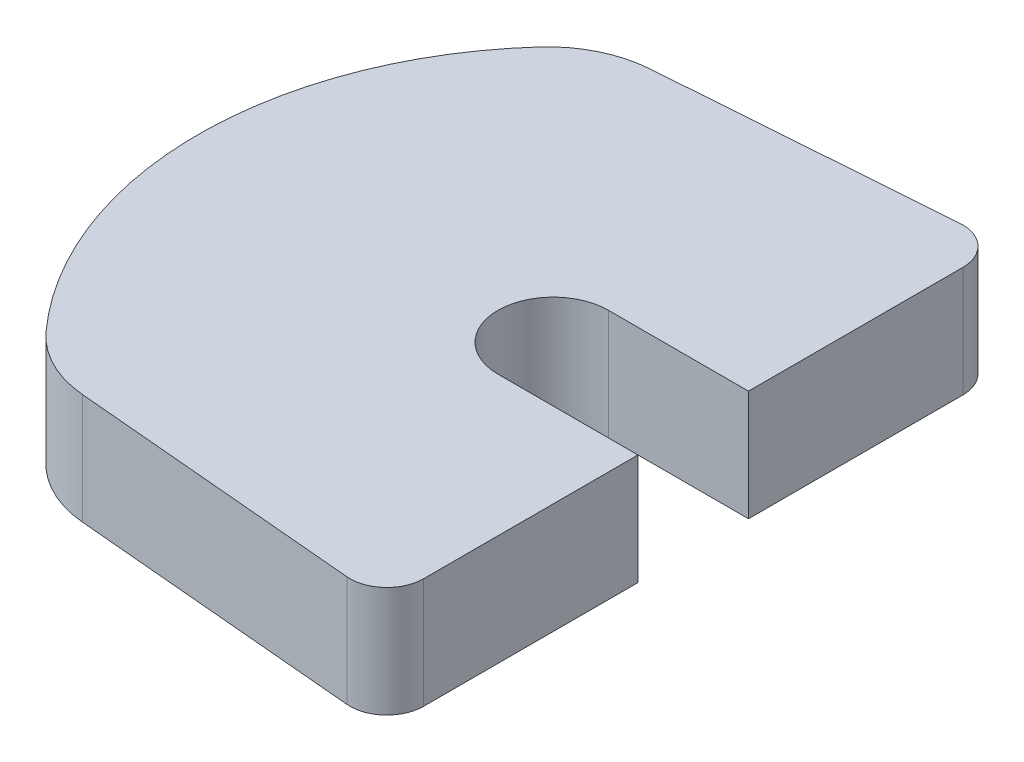
ISO-10303-21;
HEADER;
FILE_DESCRIPTION(('STEP AP214'),'2;1');
FILE_NAME('part.step','',(''),(''),'','','');
FILE_SCHEMA(('AUTOMOTIVE_DESIGN { 1 0 10303 214 1 1 1 1 }'));
ENDSEC;
DATA;
#1=APPLICATION_CONTEXT('core data for automotive mechanical design processes');
#2=APPLICATION_PROTOCOL_DEFINITION('international standard','automotive_design',2000,#1);
#3=PRODUCT_CONTEXT('',#1,'mechanical');
#4=PRODUCT('Part','Part','',(#3));
#5=PRODUCT_RELATED_PRODUCT_CATEGORY('part','',(#4));
#6=PRODUCT_DEFINITION_FORMATION('','',#4);
#7=PRODUCT_DEFINITION_CONTEXT('part definition',#1,'design');
#8=PRODUCT_DEFINITION('design','',#6,#7);
#9=PRODUCT_DEFINITION_SHAPE('','',#8);
#10=(LENGTH_UNIT() NAMED_UNIT(*) SI_UNIT(.MILLI.,.METRE.));
#11=(NAMED_UNIT(*) PLANE_ANGLE_UNIT() SI_UNIT($,.RADIAN.));
#12=(NAMED_UNIT(*) SI_UNIT($,.STERADIAN.) SOLID_ANGLE_UNIT());
#13=UNCERTAINTY_MEASURE_WITH_UNIT(LENGTH_MEASURE(1.E-05),#10,'distance_accuracy_value','');
#14=(GEOMETRIC_REPRESENTATION_CONTEXT(3) GLOBAL_UNCERTAINTY_ASSIGNED_CONTEXT((#13)) GLOBAL_UNIT_ASSIGNED_CONTEXT((#10,
#11,#12)) REPRESENTATION_CONTEXT('',''));
#15=CARTESIAN_POINT('',(0.,0.,0.));
#16=DIRECTION('',(0.,0.,1.));
#17=DIRECTION('',(1.,0.,0.));
#18=AXIS2_PLACEMENT_3D('',#15,#16,#17);
#19=CARTESIAN_POINT('',(0.,3.,-1.5));
#20=DIRECTION('',(0.,-1.,0.));
#21=DIRECTION('',(0.,0.,-1.));
#22=AXIS2_PLACEMENT_3D('',#19,#20,#21);
#23=CYLINDRICAL_SURFACE('',#22,1.5);
#24=CARTESIAN_POINT('',(0.,0.,-1.5));
#25=DIRECTION('',(0.,-1.,0.));
#26=DIRECTION('',(0.,0.,1.));
#27=AXIS2_PLACEMENT_3D('',#24,#25,#26);
#28=CIRCLE('',#27,1.5);
#29=CARTESIAN_POINT('',(0.,0.,0.));
#30=VERTEX_POINT('',#29);
#31=CARTESIAN_POINT('',(0.,0.,-3.));
#32=VERTEX_POINT('',#31);
#33=EDGE_CURVE('E153',#30,#32,#28,.T.);
#34=ORIENTED_EDGE('',*,*,#33,.T.);
#35=DIRECTION('',(0.,-1.,0.));
#36=VECTOR('',#35,1.);
#37=CARTESIAN_POINT('',(0.,3.,-3.));
#38=LINE('',#37,#36);
#39=CARTESIAN_POINT('',(0.,3.,-3.));
#40=VERTEX_POINT('',#39);
#41=EDGE_CURVE('E11',#40,#32,#38,.T.);
#42=ORIENTED_EDGE('',*,*,#41,.F.);
#43=CARTESIAN_POINT('',(0.,3.,-1.5));
#44=DIRECTION('',(0.,-1.,0.));
#45=DIRECTION('',(0.,0.,1.));
#46=AXIS2_PLACEMENT_3D('',#43,#44,#45);
#47=CIRCLE('',#46,1.5);
#48=CARTESIAN_POINT('',(0.,3.,0.));
#49=VERTEX_POINT('',#48);
#50=EDGE_CURVE('E175',#49,#40,#47,.T.);
#51=ORIENTED_EDGE('',*,*,#50,.F.);
#52=DIRECTION('',(0.,-1.,0.));
#53=VECTOR('',#52,1.);
#54=CARTESIAN_POINT('',(0.,3.,0.));
#55=LINE('',#54,#53);
#56=EDGE_CURVE('E149',#49,#30,#55,.T.);
#57=ORIENTED_EDGE('',*,*,#56,.T.);
#58=EDGE_LOOP('',(#34,#42,#51,#57));
#59=FACE_BOUND('',#58,.T.);
#60=ADVANCED_FACE('F33',(#59),#23,.F.);
#61=CARTESIAN_POINT('',(3.8,3.,-3.));
#62=DIRECTION('',(0.,0.,-1.));
#63=DIRECTION('',(-1.,0.,0.));
#64=AXIS2_PLACEMENT_3D('',#61,#62,#63);
#65=PLANE('',#64);
#66=DIRECTION('',(1.,0.,0.));
#67=VECTOR('',#66,1.);
#68=CARTESIAN_POINT('',(3.8,0.,-3.));
#69=LINE('',#68,#67);
#70=CARTESIAN_POINT('',(3.8,0.,-3.));
#71=VERTEX_POINT('',#70);
#72=EDGE_CURVE('E156',#32,#71,#69,.T.);
#73=ORIENTED_EDGE('',*,*,#72,.T.);
#74=DIRECTION('',(0.,-1.,0.));
#75=VECTOR('',#74,1.);
#76=CARTESIAN_POINT('',(3.8,3.,-3.));
#77=LINE('',#76,#75);
#78=CARTESIAN_POINT('',(3.8,3.,-3.));
#79=VERTEX_POINT('',#78);
#80=EDGE_CURVE('E41',#79,#71,#77,.T.);
#81=ORIENTED_EDGE('',*,*,#80,.F.);
#82=DIRECTION('',(1.,0.,0.));
#83=VECTOR('',#82,1.);
#84=CARTESIAN_POINT('',(3.8,3.,-3.));
#85=LINE('',#84,#83);
#86=EDGE_CURVE('E104',#40,#79,#85,.T.);
#87=ORIENTED_EDGE('',*,*,#86,.F.);
#88=ORIENTED_EDGE('',*,*,#41,.T.);
#89=EDGE_LOOP('',(#73,#81,#87,#88));
#90=FACE_BOUND('',#89,.T.);
#91=ADVANCED_FACE('F253',(#90),#65,.F.);
#92=CARTESIAN_POINT('',(3.8,3.,-8.81580077116831));
#93=DIRECTION('',(-1.,0.,0.));
#94=DIRECTION('',(0.,0.,1.));
#95=AXIS2_PLACEMENT_3D('',#92,#93,#94);
#96=PLANE('',#95);
#97=DIRECTION('',(0.,0.,-1.));
#98=VECTOR('',#97,1.);
#99=CARTESIAN_POINT('',(3.8,0.,-8.81580077116831));
#100=LINE('',#99,#98);
#101=CARTESIAN_POINT('',(3.8,0.,-8.81580077116831));
#102=VERTEX_POINT('',#101);
#103=EDGE_CURVE('E158',#71,#102,#100,.T.);
#104=ORIENTED_EDGE('',*,*,#103,.T.);
#105=DIRECTION('',(0.,-1.,0.));
#106=VECTOR('',#105,1.);
#107=CARTESIAN_POINT('',(3.8,3.,-8.81580077116831));
#108=LINE('',#107,#106);
#109=CARTESIAN_POINT('',(3.8,3.,-8.81580077116831));
#110=VERTEX_POINT('',#109);
#111=EDGE_CURVE('E194',#110,#102,#108,.T.);
#112=ORIENTED_EDGE('',*,*,#111,.F.);
#113=DIRECTION('',(0.,0.,-1.));
#114=VECTOR('',#113,1.);
#115=CARTESIAN_POINT('',(3.8,3.,-8.81580077116831));
#116=LINE('',#115,#114);
#117=EDGE_CURVE('E202',#79,#110,#116,.T.);
#118=ORIENTED_EDGE('',*,*,#117,.F.);
#119=ORIENTED_EDGE('',*,*,#80,.T.);
#120=EDGE_LOOP('',(#104,#112,#118,#119));
#121=FACE_BOUND('',#120,.T.);
#122=ADVANCED_FACE('F200',(#121),#96,.F.);
#123=CARTESIAN_POINT('',(2.8,3.,-8.81580077116831));
#124=DIRECTION('',(0.,-1.,0.));
#125=DIRECTION('',(0.,0.,-1.));
#126=AXIS2_PLACEMENT_3D('',#123,#124,#125);
#127=CYLINDRICAL_SURFACE('',#126,1.);
#128=CARTESIAN_POINT('',(2.8,0.,-8.81580077116831));
#129=DIRECTION('',(0.,1.,0.));
#130=DIRECTION('',(0.,0.,-1.));
#131=AXIS2_PLACEMENT_3D('',#128,#129,#130);
#132=CIRCLE('',#131,1.);
#133=CARTESIAN_POINT('',(2.72663481559206,0.,-9.81310591490156));
#134=VERTEX_POINT('',#133);
#135=EDGE_CURVE('E160',#102,#134,#132,.T.);
#136=ORIENTED_EDGE('',*,*,#135,.T.);
#137=DIRECTION('',(0.,-1.,0.));
#138=VECTOR('',#137,1.);
#139=CARTESIAN_POINT('',(2.72663481559206,3.,-9.81310591490156));
#140=LINE('',#139,#138);
#141=CARTESIAN_POINT('',(2.72663481559206,3.,-9.81310591490156));
#142=VERTEX_POINT('',#141);
#143=EDGE_CURVE('E191',#142,#134,#140,.T.);
#144=ORIENTED_EDGE('',*,*,#143,.F.);
#145=CARTESIAN_POINT('',(2.8,3.,-8.81580077116831));
#146=DIRECTION('',(0.,1.,0.));
#147=DIRECTION('',(0.,0.,-1.));
#148=AXIS2_PLACEMENT_3D('',#145,#146,#147);
#149=CIRCLE('',#148,1.);
#150=EDGE_CURVE('E220',#110,#142,#149,.T.);
#151=ORIENTED_EDGE('',*,*,#150,.F.);
#152=ORIENTED_EDGE('',*,*,#111,.T.);
#153=EDGE_LOOP('',(#136,#144,#151,#152));
#154=FACE_BOUND('',#153,.T.);
#155=ADVANCED_FACE('F211',(#154),#127,.T.);
#156=CARTESIAN_POINT('',(-5.12000453173475,3.,-9.23588023195329));
#157=DIRECTION('',(0.0733651844079418,0.,0.997305143733245));
#158=DIRECTION('',(0.997305143733245,0.,-0.0733651844079418));
#159=AXIS2_PLACEMENT_3D('',#156,#157,#158);
#160=PLANE('',#159);
#161=DIRECTION('',(-0.997305143733245,0.,0.0733651844079418));
#162=VECTOR('',#161,1.);
#163=CARTESIAN_POINT('',(-5.12000453173475,0.,-9.23588023195329));
#164=LINE('',#163,#162);
#165=CARTESIAN_POINT('',(-5.12000453173475,0.,-9.23588023195329));
#166=VERTEX_POINT('',#165);
#167=EDGE_CURVE('E162',#134,#166,#164,.T.);
#168=ORIENTED_EDGE('',*,*,#167,.T.);
#169=DIRECTION('',(0.,-1.,0.));
#170=VECTOR('',#169,1.);
#171=CARTESIAN_POINT('',(-5.12000453173475,3.,-9.23588023195329));
#172=LINE('',#171,#170);
#173=CARTESIAN_POINT('',(-5.12000453173475,3.,-9.23588023195329));
#174=VERTEX_POINT('',#173);
#175=EDGE_CURVE('E188',#174,#166,#172,.T.);
#176=ORIENTED_EDGE('',*,*,#175,.F.);
#177=DIRECTION('',(-0.997305143733245,0.,0.0733651844079418));
#178=VECTOR('',#177,1.);
#179=CARTESIAN_POINT('',(-5.12000453173475,3.,-9.23588023195329));
#180=LINE('',#179,#178);
#181=EDGE_CURVE('E217',#142,#174,#180,.T.);
#182=ORIENTED_EDGE('',*,*,#181,.F.);
#183=ORIENTED_EDGE('',*,*,#143,.T.);
#184=EDGE_LOOP('',(#168,#176,#182,#183));
#185=FACE_BOUND('',#184,.T.);
#186=ADVANCED_FACE('F215',(#185),#160,.F.);
#187=CARTESIAN_POINT('',(-4.89990897851092,3.,-6.24396480075355));
#188=DIRECTION('',(0.,-1.,0.));
#189=DIRECTION('',(0.,0.,-1.));
#190=AXIS2_PLACEMENT_3D('',#187,#188,#189);
#191=CYLINDRICAL_SURFACE('',#190,3.);
#192=CARTESIAN_POINT('',(-4.89990897851092,0.,-6.24396480075355));
#193=DIRECTION('',(0.,1.,0.));
#194=DIRECTION('',(0.,0.,-1.));
#195=AXIS2_PLACEMENT_3D('',#192,#193,#194);
#196=CIRCLE('',#195,3.);
#197=CARTESIAN_POINT('',(-7.12844139787275,0.,-8.25235800325482));
#198=VERTEX_POINT('',#197);
#199=EDGE_CURVE('E164',#166,#198,#196,.T.);
#200=ORIENTED_EDGE('',*,*,#199,.T.);
#201=DIRECTION('',(0.,-1.,0.));
#202=VECTOR('',#201,1.);
#203=CARTESIAN_POINT('',(-7.12844139787275,3.,-8.25235800325482));
#204=LINE('',#203,#202);
#205=CARTESIAN_POINT('',(-7.12844139787275,3.,-8.25235800325482));
#206=VERTEX_POINT('',#205);
#207=EDGE_CURVE('E185',#206,#198,#204,.T.);
#208=ORIENTED_EDGE('',*,*,#207,.F.);
#209=CARTESIAN_POINT('',(-4.89990897851092,3.,-6.24396480075355));
#210=DIRECTION('',(0.,1.,0.));
#211=DIRECTION('',(0.,0.,-1.));
#212=AXIS2_PLACEMENT_3D('',#209,#210,#211);
#213=CIRCLE('',#212,3.);
#214=EDGE_CURVE('E219',#174,#206,#213,.T.);
#215=ORIENTED_EDGE('',*,*,#214,.F.);
#216=ORIENTED_EDGE('',*,*,#175,.T.);
#217=EDGE_LOOP('',(#200,#208,#215,#216));
#218=FACE_BOUND('',#217,.T.);
#219=ADVANCED_FACE('F266',(#218),#191,.T.);
#220=CARTESIAN_POINT('',(0.300000000000001,3.,-1.55771399491724));
#221=DIRECTION('',(0.,-1.,0.));
#222=DIRECTION('',(0.,0.,-1.));
#223=AXIS2_PLACEMENT_3D('',#220,#221,#222);
#224=CYLINDRICAL_SURFACE('',#223,9.99999999999999);
#225=CARTESIAN_POINT('',(0.300000000000001,0.,-1.55771399491724));
#226=DIRECTION('',(0.,1.,0.));
#227=DIRECTION('',(0.,0.,-1.));
#228=AXIS2_PLACEMENT_3D('',#225,#226,#227);
#229=CIRCLE('',#228,9.99999999999999);
#230=CARTESIAN_POINT('',(-7.12844139787274,0.,5.13693001342035));
#231=VERTEX_POINT('',#230);
#232=EDGE_CURVE('E166',#198,#231,#229,.T.);
#233=ORIENTED_EDGE('',*,*,#232,.T.);
#234=DIRECTION('',(0.,-1.,0.));
#235=VECTOR('',#234,1.);
#236=CARTESIAN_POINT('',(-7.12844139787274,3.,5.13693001342035));
#237=LINE('',#236,#235);
#238=CARTESIAN_POINT('',(-7.12844139787274,3.,5.13693001342035));
#239=VERTEX_POINT('',#238);
#240=EDGE_CURVE('E182',#239,#231,#237,.T.);
#241=ORIENTED_EDGE('',*,*,#240,.F.);
#242=CARTESIAN_POINT('',(0.300000000000001,3.,-1.55771399491724));
#243=DIRECTION('',(0.,1.,0.));
#244=DIRECTION('',(0.,0.,-1.));
#245=AXIS2_PLACEMENT_3D('',#242,#243,#244);
#246=CIRCLE('',#245,9.99999999999999);
#247=EDGE_CURVE('E222',#206,#239,#246,.T.);
#248=ORIENTED_EDGE('',*,*,#247,.F.);
#249=ORIENTED_EDGE('',*,*,#207,.T.);
#250=EDGE_LOOP('',(#233,#241,#248,#249));
#251=FACE_BOUND('',#250,.T.);
#252=ADVANCED_FACE('F269',(#251),#224,.T.);
#253=CARTESIAN_POINT('',(-4.89990897851092,3.,3.12853681091907));
#254=DIRECTION('',(0.,-1.,0.));
#255=DIRECTION('',(0.,0.,-1.));
#256=AXIS2_PLACEMENT_3D('',#253,#254,#255);
#257=CYLINDRICAL_SURFACE('',#256,3.);
#258=CARTESIAN_POINT('',(-4.89990897851092,0.,3.12853681091907));
#259=DIRECTION('',(0.,1.,0.));
#260=DIRECTION('',(0.,0.,-1.));
#261=AXIS2_PLACEMENT_3D('',#258,#259,#260);
#262=CIRCLE('',#261,3.);
#263=CARTESIAN_POINT('',(-5.1636242406616,0.,6.1169233756909));
#264=VERTEX_POINT('',#263);
#265=EDGE_CURVE('E168',#231,#264,#262,.T.);
#266=ORIENTED_EDGE('',*,*,#265,.T.);
#267=DIRECTION('',(0.,-1.,0.));
#268=VECTOR('',#267,1.);
#269=CARTESIAN_POINT('',(-5.1636242406616,3.,6.1169233756909));
#270=LINE('',#269,#268);
#271=CARTESIAN_POINT('',(-5.1636242406616,3.,6.1169233756909));
#272=VERTEX_POINT('',#271);
#273=EDGE_CURVE('E179',#272,#264,#270,.T.);
#274=ORIENTED_EDGE('',*,*,#273,.F.);
#275=CARTESIAN_POINT('',(-4.89990897851092,3.,3.12853681091907));
#276=DIRECTION('',(0.,1.,0.));
#277=DIRECTION('',(0.,0.,-1.));
#278=AXIS2_PLACEMENT_3D('',#275,#276,#277);
#279=CIRCLE('',#278,3.);
#280=EDGE_CURVE('E228',#239,#272,#279,.T.);
#281=ORIENTED_EDGE('',*,*,#280,.F.);
#282=ORIENTED_EDGE('',*,*,#240,.T.);
#283=EDGE_LOOP('',(#266,#274,#281,#282));
#284=FACE_BOUND('',#283,.T.);
#285=ADVANCED_FACE('F234',(#284),#257,.T.);
#286=CARTESIAN_POINT('',(2.71209491261644,3.,6.81192962609225));
#287=DIRECTION('',(0.0879050873835595,0.,-0.996128854923944));
#288=DIRECTION('',(-0.996128854923944,0.,-0.0879050873835595));
#289=AXIS2_PLACEMENT_3D('',#286,#287,#288);
#290=PLANE('',#289);
#291=DIRECTION('',(0.996128854923945,0.,0.0879050873835595));
#292=VECTOR('',#291,1.);
#293=CARTESIAN_POINT('',(2.71209491261644,0.,6.81192962609225));
#294=LINE('',#293,#292);
#295=CARTESIAN_POINT('',(2.71209491261644,0.,6.81192962609225));
#296=VERTEX_POINT('',#295);
#297=EDGE_CURVE('E170',#264,#296,#294,.T.);
#298=ORIENTED_EDGE('',*,*,#297,.T.);
#299=DIRECTION('',(0.,-1.,0.));
#300=VECTOR('',#299,1.);
#301=CARTESIAN_POINT('',(2.71209491261644,3.,6.81192962609225));
#302=LINE('',#301,#300);
#303=CARTESIAN_POINT('',(2.71209491261644,3.,6.81192962609225));
#304=VERTEX_POINT('',#303);
#305=EDGE_CURVE('E144',#304,#296,#302,.T.);
#306=ORIENTED_EDGE('',*,*,#305,.F.);
#307=DIRECTION('',(0.996128854923945,0.,0.0879050873835595));
#308=VECTOR('',#307,1.);
#309=CARTESIAN_POINT('',(2.71209491261644,3.,6.81192962609225));
#310=LINE('',#309,#308);
#311=EDGE_CURVE('E135',#272,#304,#310,.T.);
#312=ORIENTED_EDGE('',*,*,#311,.F.);
#313=ORIENTED_EDGE('',*,*,#273,.T.);
#314=EDGE_LOOP('',(#298,#306,#312,#313));
#315=FACE_BOUND('',#314,.T.);
#316=ADVANCED_FACE('F238',(#315),#290,.F.);
#317=CARTESIAN_POINT('',(2.8,3.,5.81580077116831));
#318=DIRECTION('',(0.,-1.,0.));
#319=DIRECTION('',(0.,0.,-1.));
#320=AXIS2_PLACEMENT_3D('',#317,#318,#319);
#321=CYLINDRICAL_SURFACE('',#320,1.);
#322=CARTESIAN_POINT('',(2.8,0.,5.81580077116831));
#323=DIRECTION('',(0.,1.,0.));
#324=DIRECTION('',(0.,0.,-1.));
#325=AXIS2_PLACEMENT_3D('',#322,#323,#324);
#326=CIRCLE('',#325,1.);
#327=CARTESIAN_POINT('',(3.8,0.,5.81580077116831));
#328=VERTEX_POINT('',#327);
#329=EDGE_CURVE('E143',#296,#328,#326,.T.);
#330=ORIENTED_EDGE('',*,*,#329,.T.);
#331=DIRECTION('',(0.,-1.,0.));
#332=VECTOR('',#331,1.);
#333=CARTESIAN_POINT('',(3.8,3.,5.81580077116831));
#334=LINE('',#333,#332);
#335=CARTESIAN_POINT('',(3.8,3.,5.81580077116831));
#336=VERTEX_POINT('',#335);
#337=EDGE_CURVE('E140',#336,#328,#334,.T.);
#338=ORIENTED_EDGE('',*,*,#337,.F.);
#339=CARTESIAN_POINT('',(2.8,3.,5.81580077116831));
#340=DIRECTION('',(0.,1.,0.));
#341=DIRECTION('',(0.,0.,-1.));
#342=AXIS2_PLACEMENT_3D('',#339,#340,#341);
#343=CIRCLE('',#342,1.);
#344=EDGE_CURVE('E129',#304,#336,#343,.T.);
#345=ORIENTED_EDGE('',*,*,#344,.F.);
#346=ORIENTED_EDGE('',*,*,#305,.T.);
#347=EDGE_LOOP('',(#330,#338,#345,#346));
#348=FACE_BOUND('',#347,.T.);
#349=ADVANCED_FACE('F141',(#348),#321,.T.);
#350=CARTESIAN_POINT('',(3.8,3.,0.));
#351=DIRECTION('',(-1.,0.,0.));
#352=DIRECTION('',(0.,0.,1.));
#353=AXIS2_PLACEMENT_3D('',#350,#351,#352);
#354=PLANE('',#353);
#355=DIRECTION('',(0.,0.,-1.));
#356=VECTOR('',#355,1.);
#357=CARTESIAN_POINT('',(3.8,0.,0.));
#358=LINE('',#357,#356);
#359=CARTESIAN_POINT('',(3.8,0.,0.));
#360=VERTEX_POINT('',#359);
#361=EDGE_CURVE('E90',#328,#360,#358,.T.);
#362=ORIENTED_EDGE('',*,*,#361,.T.);
#363=DIRECTION('',(0.,-1.,0.));
#364=VECTOR('',#363,1.);
#365=CARTESIAN_POINT('',(3.8,3.,0.));
#366=LINE('',#365,#364);
#367=CARTESIAN_POINT('',(3.8,3.,0.));
#368=VERTEX_POINT('',#367);
#369=EDGE_CURVE('E145',#368,#360,#366,.T.);
#370=ORIENTED_EDGE('',*,*,#369,.F.);
#371=DIRECTION('',(0.,0.,-1.));
#372=VECTOR('',#371,1.);
#373=CARTESIAN_POINT('',(3.8,3.,0.));
#374=LINE('',#373,#372);
#375=EDGE_CURVE('E133',#336,#368,#374,.T.);
#376=ORIENTED_EDGE('',*,*,#375,.F.);
#377=ORIENTED_EDGE('',*,*,#337,.T.);
#378=EDGE_LOOP('',(#362,#370,#376,#377));
#379=FACE_BOUND('',#378,.T.);
#380=ADVANCED_FACE('F147',(#379),#354,.F.);
#381=CARTESIAN_POINT('',(0.,3.,0.));
#382=DIRECTION('',(0.,0.,1.));
#383=DIRECTION('',(1.,0.,0.));
#384=AXIS2_PLACEMENT_3D('',#381,#382,#383);
#385=PLANE('',#384);
#386=DIRECTION('',(-1.,0.,0.));
#387=VECTOR('',#386,1.);
#388=CARTESIAN_POINT('',(0.,0.,0.));
#389=LINE('',#388,#387);
#390=EDGE_CURVE('E96',#360,#30,#389,.T.);
#391=ORIENTED_EDGE('',*,*,#390,.T.);
#392=ORIENTED_EDGE('',*,*,#56,.F.);
#393=DIRECTION('',(-1.,0.,0.));
#394=VECTOR('',#393,1.);
#395=CARTESIAN_POINT('',(0.,3.,0.));
#396=LINE('',#395,#394);
#397=EDGE_CURVE('E49',#368,#49,#396,.T.);
#398=ORIENTED_EDGE('',*,*,#397,.F.);
#399=ORIENTED_EDGE('',*,*,#369,.T.);
#400=EDGE_LOOP('',(#391,#392,#398,#399));
#401=FACE_BOUND('',#400,.T.);
#402=ADVANCED_FACE('F242',(#401),#385,.F.);
#403=CARTESIAN_POINT('',(0.,3.,-1.5));
#404=DIRECTION('',(0.,1.,0.));
#405=DIRECTION('',(0.,0.,1.));
#406=AXIS2_PLACEMENT_3D('',#403,#404,#405);
#407=PLANE('',#406);
#408=ORIENTED_EDGE('',*,*,#50,.T.);
#409=ORIENTED_EDGE('',*,*,#86,.T.);
#410=ORIENTED_EDGE('',*,*,#117,.T.);
#411=ORIENTED_EDGE('',*,*,#150,.T.);
#412=ORIENTED_EDGE('',*,*,#181,.T.);
#413=ORIENTED_EDGE('',*,*,#214,.T.);
#414=ORIENTED_EDGE('',*,*,#247,.T.);
#415=ORIENTED_EDGE('',*,*,#280,.T.);
#416=ORIENTED_EDGE('',*,*,#311,.T.);
#417=ORIENTED_EDGE('',*,*,#344,.T.);
#418=ORIENTED_EDGE('',*,*,#375,.T.);
#419=ORIENTED_EDGE('',*,*,#397,.T.);
#420=EDGE_LOOP('',(#408,#409,#410,#411,#412,#413,#414,#415,#416,#417,#418,#419));
#421=FACE_BOUND('',#420,.T.);
#422=ADVANCED_FACE('F131',(#421),#407,.T.);
#423=CARTESIAN_POINT('',(0.,0.,-1.5));
#424=DIRECTION('',(0.,1.,0.));
#425=DIRECTION('',(0.,0.,1.));
#426=AXIS2_PLACEMENT_3D('',#423,#424,#425);
#427=PLANE('',#426);
#428=ORIENTED_EDGE('',*,*,#33,.F.);
#429=ORIENTED_EDGE('',*,*,#390,.F.);
#430=ORIENTED_EDGE('',*,*,#361,.F.);
#431=ORIENTED_EDGE('',*,*,#329,.F.);
#432=ORIENTED_EDGE('',*,*,#297,.F.);
#433=ORIENTED_EDGE('',*,*,#265,.F.);
#434=ORIENTED_EDGE('',*,*,#232,.F.);
#435=ORIENTED_EDGE('',*,*,#199,.F.);
#436=ORIENTED_EDGE('',*,*,#167,.F.);
#437=ORIENTED_EDGE('',*,*,#135,.F.);
#438=ORIENTED_EDGE('',*,*,#103,.F.);
#439=ORIENTED_EDGE('',*,*,#72,.F.);
#440=EDGE_LOOP('',(#428,#429,#430,#431,#432,#433,#434,#435,#436,#437,#438,#439));
#441=FACE_BOUND('',#440,.T.);
#442=ADVANCED_FACE('F206',(#441),#427,.F.);
#443=CLOSED_SHELL('',(#60,#91,#122,#155,#186,#219,#252,#285,#316,#349,#380,#402,#422,#442));
#444=MANIFOLD_SOLID_BREP('B2',#443);
#445=ADVANCED_BREP_SHAPE_REPRESENTATION('',(#18,#444),#14);
#446=SHAPE_DEFINITION_REPRESENTATION(#9,#445);
ENDSEC;
END-ISO-10303-21;
